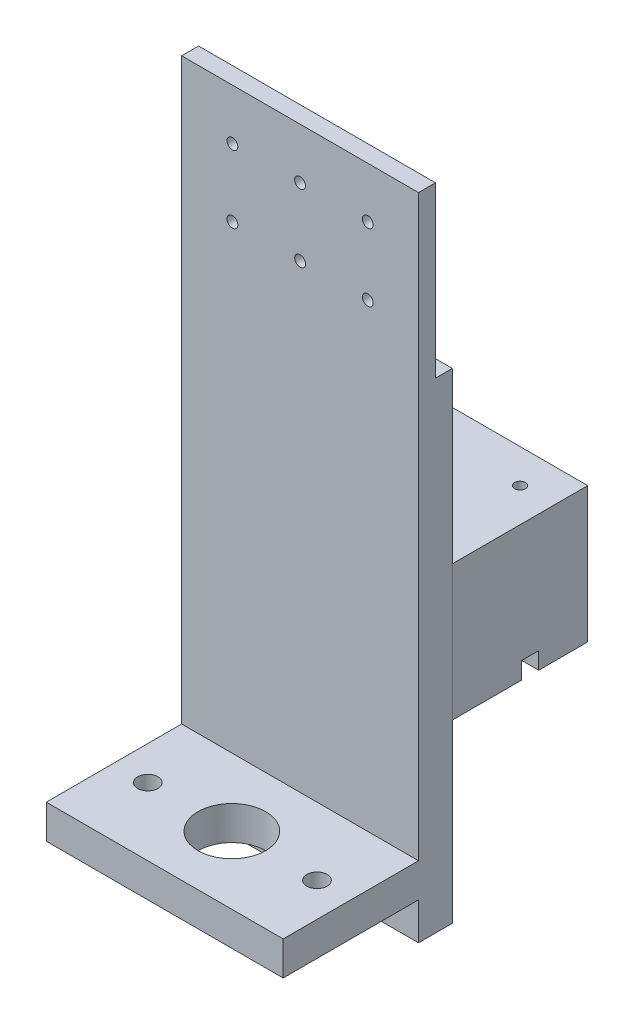
ISO-10303-21;
HEADER;
FILE_DESCRIPTION(('STEP AP214'),'2;1');
FILE_NAME('part.step','',(''),(''),'','','');
FILE_SCHEMA(('AUTOMOTIVE_DESIGN { 1 0 10303 214 1 1 1 1 }'));
ENDSEC;
DATA;
#1=APPLICATION_CONTEXT('core data for automotive mechanical design processes');
#2=APPLICATION_PROTOCOL_DEFINITION('international standard','automotive_design',2000,#1);
#3=PRODUCT_CONTEXT('',#1,'mechanical');
#4=PRODUCT('Part','Part','',(#3));
#5=PRODUCT_RELATED_PRODUCT_CATEGORY('part','',(#4));
#6=PRODUCT_DEFINITION_FORMATION('','',#4);
#7=PRODUCT_DEFINITION_CONTEXT('part definition',#1,'design');
#8=PRODUCT_DEFINITION('design','',#6,#7);
#9=PRODUCT_DEFINITION_SHAPE('','',#8);
#10=(LENGTH_UNIT() NAMED_UNIT(*) SI_UNIT(.MILLI.,.METRE.));
#11=(NAMED_UNIT(*) PLANE_ANGLE_UNIT() SI_UNIT($,.RADIAN.));
#12=(NAMED_UNIT(*) SI_UNIT($,.STERADIAN.) SOLID_ANGLE_UNIT());
#13=UNCERTAINTY_MEASURE_WITH_UNIT(LENGTH_MEASURE(1.E-05),#10,'distance_accuracy_value','');
#14=(GEOMETRIC_REPRESENTATION_CONTEXT(3) GLOBAL_UNCERTAINTY_ASSIGNED_CONTEXT((#13)) GLOBAL_UNIT_ASSIGNED_CONTEXT((#10,
#11,#12)) REPRESENTATION_CONTEXT('',''));
#15=CARTESIAN_POINT('',(0.,0.,0.));
#16=DIRECTION('',(0.,0.,1.));
#17=DIRECTION('',(1.,0.,0.));
#18=AXIS2_PLACEMENT_3D('',#15,#16,#17);
#19=CARTESIAN_POINT('',(37.8741031645975,90.,27.7151189199662));
#20=DIRECTION('',(0.,0.,1.));
#21=DIRECTION('',(1.,0.,0.));
#22=AXIS2_PLACEMENT_3D('',#19,#20,#21);
#23=PLANE('',#22);
#24=CARTESIAN_POINT('',(22.8641031645975,125.,27.7151189199662));
#25=DIRECTION('',(0.,0.,1.));
#26=DIRECTION('',(1.,0.,0.));
#27=AXIS2_PLACEMENT_3D('',#24,#25,#26);
#28=CIRCLE('',#27,1.60000000000001);
#29=CARTESIAN_POINT('',(24.4641031645975,125.,27.7151189199662));
#30=VERTEX_POINT('',#29);
#31=EDGE_CURVE('E250',#30,#30,#28,.F.);
#32=ORIENTED_EDGE('',*,*,#31,.F.);
#33=EDGE_LOOP('',(#32));
#34=FACE_BOUND('',#33,.T.);
#35=CARTESIAN_POINT('',(-17.1358968354025,125.,27.7151189199662));
#36=DIRECTION('',(0.,0.,1.));
#37=DIRECTION('',(1.,0.,0.));
#38=AXIS2_PLACEMENT_3D('',#35,#36,#37);
#39=CIRCLE('',#38,1.60000000000001);
#40=CARTESIAN_POINT('',(-15.5358968354025,125.,27.7151189199662));
#41=VERTEX_POINT('',#40);
#42=EDGE_CURVE('E244',#41,#41,#39,.F.);
#43=ORIENTED_EDGE('',*,*,#42,.F.);
#44=EDGE_LOOP('',(#43));
#45=FACE_BOUND('',#44,.T.);
#46=CARTESIAN_POINT('',(2.86410316459753,105.,27.7151189199662));
#47=DIRECTION('',(0.,0.,1.));
#48=DIRECTION('',(1.,0.,0.));
#49=AXIS2_PLACEMENT_3D('',#46,#47,#48);
#50=CIRCLE('',#49,1.60000000000001);
#51=CARTESIAN_POINT('',(4.46410316459754,105.,27.7151189199662));
#52=VERTEX_POINT('',#51);
#53=EDGE_CURVE('E225',#52,#52,#50,.F.);
#54=ORIENTED_EDGE('',*,*,#53,.F.);
#55=EDGE_LOOP('',(#54));
#56=FACE_BOUND('',#55,.T.);
#57=CARTESIAN_POINT('',(22.8641031645975,105.,27.7151189199662));
#58=DIRECTION('',(0.,0.,1.));
#59=DIRECTION('',(1.,0.,0.));
#60=AXIS2_PLACEMENT_3D('',#57,#58,#59);
#61=CIRCLE('',#60,1.60000000000001);
#62=CARTESIAN_POINT('',(24.4641031645975,105.,27.7151189199662));
#63=VERTEX_POINT('',#62);
#64=EDGE_CURVE('E228',#63,#63,#61,.F.);
#65=ORIENTED_EDGE('',*,*,#64,.F.);
#66=EDGE_LOOP('',(#65));
#67=FACE_BOUND('',#66,.T.);
#68=CARTESIAN_POINT('',(2.86410316459753,125.,27.7151189199662));
#69=DIRECTION('',(0.,0.,1.));
#70=DIRECTION('',(1.,0.,0.));
#71=AXIS2_PLACEMENT_3D('',#68,#69,#70);
#72=CIRCLE('',#71,1.60000000000001);
#73=CARTESIAN_POINT('',(4.46410316459754,125.,27.7151189199662));
#74=VERTEX_POINT('',#73);
#75=EDGE_CURVE('E247',#74,#74,#72,.F.);
#76=ORIENTED_EDGE('',*,*,#75,.F.);
#77=EDGE_LOOP('',(#76));
#78=FACE_BOUND('',#77,.T.);
#79=CARTESIAN_POINT('',(-17.1358968354025,105.,27.7151189199662));
#80=DIRECTION('',(0.,0.,1.));
#81=DIRECTION('',(1.,0.,0.));
#82=AXIS2_PLACEMENT_3D('',#79,#80,#81);
#83=CIRCLE('',#82,1.60000000000001);
#84=CARTESIAN_POINT('',(-15.5358968354025,105.,27.7151189199662));
#85=VERTEX_POINT('',#84);
#86=EDGE_CURVE('E231',#85,#85,#83,.F.);
#87=ORIENTED_EDGE('',*,*,#86,.F.);
#88=EDGE_LOOP('',(#87));
#89=FACE_BOUND('',#88,.T.);
#90=DIRECTION('',(-1.,0.,0.));
#91=VECTOR('',#90,1.);
#92=CARTESIAN_POINT('',(37.8741031645975,90.,27.7151189199662));
#93=LINE('',#92,#91);
#94=CARTESIAN_POINT('',(37.8641031645975,90.,27.7151189199662));
#95=VERTEX_POINT('',#94);
#96=CARTESIAN_POINT('',(-32.1358968354025,90.,27.7151189199662));
#97=VERTEX_POINT('',#96);
#98=EDGE_CURVE('E81',#95,#97,#93,.T.);
#99=ORIENTED_EDGE('',*,*,#98,.T.);
#100=DIRECTION('',(0.,-1.,0.));
#101=VECTOR('',#100,1.);
#102=CARTESIAN_POINT('',(-32.1358968354025,236.,27.7151189199662));
#103=LINE('',#102,#101);
#104=CARTESIAN_POINT('',(-32.1358968354025,140.,27.7151189199662));
#105=VERTEX_POINT('',#104);
#106=EDGE_CURVE('E89',#105,#97,#103,.T.);
#107=ORIENTED_EDGE('',*,*,#106,.F.);
#108=DIRECTION('',(-1.,0.,0.));
#109=VECTOR('',#108,1.);
#110=CARTESIAN_POINT('',(37.8741031645975,140.,27.7151189199662));
#111=LINE('',#110,#109);
#112=CARTESIAN_POINT('',(37.8641031645975,140.,27.7151189199662));
#113=VERTEX_POINT('',#112);
#114=EDGE_CURVE('E13',#113,#105,#111,.T.);
#115=ORIENTED_EDGE('',*,*,#114,.F.);
#116=DIRECTION('',(0.,1.,0.));
#117=VECTOR('',#116,1.);
#118=CARTESIAN_POINT('',(37.8641031645975,236.,27.7151189199662));
#119=LINE('',#118,#117);
#120=EDGE_CURVE('E255',#95,#113,#119,.T.);
#121=ORIENTED_EDGE('',*,*,#120,.F.);
#122=EDGE_LOOP('',(#99,#107,#115,#121));
#123=FACE_BOUND('',#122,.T.);
#124=ADVANCED_FACE('F72',(#34,#45,#56,#67,#78,#89,#123),#23,.F.);
#125=CARTESIAN_POINT('',(37.8741031645975,140.,27.7151189199662));
#126=DIRECTION('',(0.,-1.,0.));
#127=DIRECTION('',(0.,0.,-1.));
#128=AXIS2_PLACEMENT_3D('',#125,#126,#127);
#129=PLANE('',#128);
#130=ORIENTED_EDGE('',*,*,#114,.T.);
#131=DIRECTION('',(0.,0.,-1.));
#132=VECTOR('',#131,1.);
#133=CARTESIAN_POINT('',(-32.1358968354025,140.,22.7151189199662));
#134=LINE('',#133,#132);
#135=CARTESIAN_POINT('',(-32.1358968354025,140.,32.7151189199662));
#136=VERTEX_POINT('',#135);
#137=EDGE_CURVE('E229',#136,#105,#134,.T.);
#138=ORIENTED_EDGE('',*,*,#137,.F.);
#139=DIRECTION('',(-1.,0.,0.));
#140=VECTOR('',#139,1.);
#141=CARTESIAN_POINT('',(-32.1358968354025,140.,32.7151189199662));
#142=LINE('',#141,#140);
#143=CARTESIAN_POINT('',(37.8641031645975,140.,32.7151189199662));
#144=VERTEX_POINT('',#143);
#145=EDGE_CURVE('E239',#144,#136,#142,.T.);
#146=ORIENTED_EDGE('',*,*,#145,.F.);
#147=DIRECTION('',(0.,0.,1.));
#148=VECTOR('',#147,1.);
#149=CARTESIAN_POINT('',(37.8641031645975,140.,32.7151189199662));
#150=LINE('',#149,#148);
#151=EDGE_CURVE('E238',#113,#144,#150,.T.);
#152=ORIENTED_EDGE('',*,*,#151,.F.);
#153=EDGE_LOOP('',(#130,#138,#146,#152));
#154=FACE_BOUND('',#153,.T.);
#155=ADVANCED_FACE('F267',(#154),#129,.F.);
#156=CARTESIAN_POINT('',(37.8741031645975,90.,22.7151189199662));
#157=DIRECTION('',(0.,-1.,0.));
#158=DIRECTION('',(0.,0.,-1.));
#159=AXIS2_PLACEMENT_3D('',#156,#157,#158);
#160=PLANE('',#159);
#161=DIRECTION('',(1.,0.,0.));
#162=VECTOR('',#161,1.);
#163=CARTESIAN_POINT('',(37.8641031645975,90.,22.7151189199662));
#164=LINE('',#163,#162);
#165=CARTESIAN_POINT('',(-32.1358968354025,90.,22.7151189199662));
#166=VERTEX_POINT('',#165);
#167=CARTESIAN_POINT('',(37.8641031645975,90.,22.7151189199662));
#168=VERTEX_POINT('',#167);
#169=EDGE_CURVE('E235',#166,#168,#164,.T.);
#170=ORIENTED_EDGE('',*,*,#169,.F.);
#171=DIRECTION('',(0.,0.,-1.));
#172=VECTOR('',#171,1.);
#173=CARTESIAN_POINT('',(-32.1358968354025,90.,22.7151189199658));
#174=LINE('',#173,#172);
#175=EDGE_CURVE('E233',#97,#166,#174,.T.);
#176=ORIENTED_EDGE('',*,*,#175,.F.);
#177=ORIENTED_EDGE('',*,*,#98,.F.);
#178=DIRECTION('',(0.,0.,1.));
#179=VECTOR('',#178,1.);
#180=CARTESIAN_POINT('',(37.8641031645975,90.,32.7151189199658));
#181=LINE('',#180,#179);
#182=EDGE_CURVE('E76',#168,#95,#181,.T.);
#183=ORIENTED_EDGE('',*,*,#182,.F.);
#184=EDGE_LOOP('',(#170,#176,#177,#183));
#185=FACE_BOUND('',#184,.T.);
#186=ADVANCED_FACE('F74',(#185),#160,.F.);
#187=CARTESIAN_POINT('',(27.8641031645975,-37.,52.7151189199662));
#188=DIRECTION('',(0.,-1.,0.));
#189=DIRECTION('',(0.,0.,-1.));
#190=AXIS2_PLACEMENT_3D('',#187,#188,#189);
#191=PLANE('',#190);
#192=CARTESIAN_POINT('',(27.8641031645975,-37.,52.7151189199662));
#193=DIRECTION('',(0.,-1.,0.));
#194=DIRECTION('',(0.,0.,-1.));
#195=AXIS2_PLACEMENT_3D('',#192,#193,#194);
#196=CIRCLE('',#195,3.);
#197=CARTESIAN_POINT('',(27.8641031645975,-37.,49.7151189199662));
#198=VERTEX_POINT('',#197);
#199=EDGE_CURVE('E222',#198,#198,#196,.F.);
#200=ORIENTED_EDGE('',*,*,#199,.T.);
#201=EDGE_LOOP('',(#200));
#202=FACE_BOUND('',#201,.T.);
#203=ADVANCED_FACE('F377',(#202),#191,.F.);
#204=CARTESIAN_POINT('',(-22.1358968354025,-37.,52.7151189199662));
#205=DIRECTION('',(0.,-1.,0.));
#206=DIRECTION('',(0.,0.,-1.));
#207=AXIS2_PLACEMENT_3D('',#204,#205,#206);
#208=PLANE('',#207);
#209=CARTESIAN_POINT('',(-22.1358968354025,-37.,52.7151189199662));
#210=DIRECTION('',(0.,-1.,0.));
#211=DIRECTION('',(0.,0.,-1.));
#212=AXIS2_PLACEMENT_3D('',#209,#210,#211);
#213=CIRCLE('',#212,3.);
#214=CARTESIAN_POINT('',(-22.1358968354025,-37.,49.7151189199662));
#215=VERTEX_POINT('',#214);
#216=EDGE_CURVE('E211',#215,#215,#213,.F.);
#217=ORIENTED_EDGE('',*,*,#216,.T.);
#218=EDGE_LOOP('',(#217));
#219=FACE_BOUND('',#218,.T.);
#220=ADVANCED_FACE('F370',(#219),#208,.F.);
#221=CARTESIAN_POINT('',(27.8641031645975,261.,52.7151189199662));
#222=DIRECTION('',(0.,-1.,0.));
#223=DIRECTION('',(0.,0.,-1.));
#224=AXIS2_PLACEMENT_3D('',#221,#222,#223);
#225=CYLINDRICAL_SURFACE('',#224,3.);
#226=CARTESIAN_POINT('',(27.8641031645975,-31.,52.7151189199662));
#227=DIRECTION('',(0.,-1.,0.));
#228=DIRECTION('',(1.,0.,0.));
#229=AXIS2_PLACEMENT_3D('',#226,#227,#228);
#230=CIRCLE('',#229,3.);
#231=CARTESIAN_POINT('',(30.8641031645976,-31.,52.7151189199662));
#232=VERTEX_POINT('',#231);
#233=EDGE_CURVE('E212',#232,#232,#230,.T.);
#234=ORIENTED_EDGE('',*,*,#233,.F.);
#235=EDGE_LOOP('',(#234));
#236=FACE_BOUND('',#235,.T.);
#237=ORIENTED_EDGE('',*,*,#199,.F.);
#238=EDGE_LOOP('',(#237));
#239=FACE_BOUND('',#238,.T.);
#240=ADVANCED_FACE('F366',(#236,#239),#225,.F.);
#241=CARTESIAN_POINT('',(-22.1358968354025,261.,52.7151189199662));
#242=DIRECTION('',(0.,-1.,0.));
#243=DIRECTION('',(0.,0.,-1.));
#244=AXIS2_PLACEMENT_3D('',#241,#242,#243);
#245=CYLINDRICAL_SURFACE('',#244,3.);
#246=CARTESIAN_POINT('',(-22.1358968354025,-31.,52.7151189199662));
#247=DIRECTION('',(0.,-1.,0.));
#248=DIRECTION('',(1.,0.,0.));
#249=AXIS2_PLACEMENT_3D('',#246,#247,#248);
#250=CIRCLE('',#249,3.);
#251=CARTESIAN_POINT('',(-19.1358968354025,-31.,52.7151189199662));
#252=VERTEX_POINT('',#251);
#253=EDGE_CURVE('E215',#252,#252,#250,.T.);
#254=ORIENTED_EDGE('',*,*,#253,.F.);
#255=EDGE_LOOP('',(#254));
#256=FACE_BOUND('',#255,.T.);
#257=ORIENTED_EDGE('',*,*,#216,.F.);
#258=EDGE_LOOP('',(#257));
#259=FACE_BOUND('',#258,.T.);
#260=ADVANCED_FACE('F369',(#256,#259),#245,.F.);
#261=CARTESIAN_POINT('',(2.70445452144315,261.001,52.7151189199662));
#262=DIRECTION('',(0.,-1.,0.));
#263=DIRECTION('',(0.,0.,-1.));
#264=AXIS2_PLACEMENT_3D('',#261,#262,#263);
#265=CYLINDRICAL_SURFACE('',#264,10.);
#266=CARTESIAN_POINT('',(2.70445452144315,-41.,52.7151189199662));
#267=DIRECTION('',(0.,-1.,0.));
#268=DIRECTION('',(0.,0.,-1.));
#269=AXIS2_PLACEMENT_3D('',#266,#267,#268);
#270=CIRCLE('',#269,10.);
#271=CARTESIAN_POINT('',(2.70445452144315,-41.,42.7151189199662));
#272=VERTEX_POINT('',#271);
#273=EDGE_CURVE('E284',#272,#272,#270,.T.);
#274=ORIENTED_EDGE('',*,*,#273,.T.);
#275=EDGE_LOOP('',(#274));
#276=FACE_BOUND('',#275,.T.);
#277=CARTESIAN_POINT('',(2.70445452144315,-31.,52.7151189199662));
#278=DIRECTION('',(0.,-1.,0.));
#279=DIRECTION('',(1.,0.,0.));
#280=AXIS2_PLACEMENT_3D('',#277,#278,#279);
#281=CIRCLE('',#280,10.);
#282=CARTESIAN_POINT('',(12.7044545214432,-31.,52.7151189199662));
#283=VERTEX_POINT('',#282);
#284=EDGE_CURVE('E216',#283,#283,#281,.F.);
#285=ORIENTED_EDGE('',*,*,#284,.T.);
#286=EDGE_LOOP('',(#285));
#287=FACE_BOUND('',#286,.T.);
#288=ADVANCED_FACE('F336',(#276,#287),#265,.F.);
#289=CARTESIAN_POINT('',(37.8641031645975,236.,32.7151189199662));
#290=DIRECTION('',(-1.,0.,0.));
#291=DIRECTION('',(0.,0.,1.));
#292=AXIS2_PLACEMENT_3D('',#289,#290,#291);
#293=PLANE('',#292);
#294=DIRECTION('',(0.,-1.,0.));
#295=VECTOR('',#294,1.);
#296=CARTESIAN_POINT('',(37.8641031645975,236.,22.7151189199662));
#297=LINE('',#296,#295);
#298=CARTESIAN_POINT('',(37.8641031645975,-52.,22.7151189199662));
#299=VERTEX_POINT('',#298);
#300=EDGE_CURVE('E209',#168,#299,#297,.T.);
#301=ORIENTED_EDGE('',*,*,#300,.F.);
#302=ORIENTED_EDGE('',*,*,#182,.T.);
#303=ORIENTED_EDGE('',*,*,#120,.T.);
#304=ORIENTED_EDGE('',*,*,#151,.T.);
#305=DIRECTION('',(0.,-1.,0.));
#306=VECTOR('',#305,1.);
#307=CARTESIAN_POINT('',(37.8641031645975,236.,32.7151189199662));
#308=LINE('',#307,#306);
#309=CARTESIAN_POINT('',(37.8641031645975,-31.,32.7151189199662));
#310=VERTEX_POINT('',#309);
#311=EDGE_CURVE('E203',#144,#310,#308,.T.);
#312=ORIENTED_EDGE('',*,*,#311,.T.);
#313=DIRECTION('',(0.,0.,-1.));
#314=VECTOR('',#313,1.);
#315=CARTESIAN_POINT('',(37.8641031645975,-31.,72.7151189199662));
#316=LINE('',#315,#314);
#317=CARTESIAN_POINT('',(37.8641031645975,-31.,72.7151189199662));
#318=VERTEX_POINT('',#317);
#319=EDGE_CURVE('E179',#318,#310,#316,.T.);
#320=ORIENTED_EDGE('',*,*,#319,.F.);
#321=DIRECTION('',(0.,1.,0.));
#322=VECTOR('',#321,1.);
#323=CARTESIAN_POINT('',(37.8641031645975,-31.,72.7151189199662));
#324=LINE('',#323,#322);
#325=CARTESIAN_POINT('',(37.8641031645975,-41.,72.7151189199662));
#326=VERTEX_POINT('',#325);
#327=EDGE_CURVE('E159',#326,#318,#324,.T.);
#328=ORIENTED_EDGE('',*,*,#327,.F.);
#329=DIRECTION('',(0.,0.,-1.));
#330=VECTOR('',#329,1.);
#331=CARTESIAN_POINT('',(37.8641031645975,-41.,72.7151189199662));
#332=LINE('',#331,#330);
#333=CARTESIAN_POINT('',(37.8641031645975,-41.,32.7151189199662));
#334=VERTEX_POINT('',#333);
#335=EDGE_CURVE('E156',#326,#334,#332,.T.);
#336=ORIENTED_EDGE('',*,*,#335,.T.);
#337=CARTESIAN_POINT('',(37.8641031645975,-52.,32.7151189199662));
#338=VERTEX_POINT('',#337);
#339=EDGE_CURVE('E202',#334,#338,#308,.T.);
#340=ORIENTED_EDGE('',*,*,#339,.T.);
#341=DIRECTION('',(0.,0.,-1.));
#342=VECTOR('',#341,1.);
#343=CARTESIAN_POINT('',(37.8641031645975,-52.,32.7151189199662));
#344=LINE('',#343,#342);
#345=EDGE_CURVE('E186',#338,#299,#344,.T.);
#346=ORIENTED_EDGE('',*,*,#345,.T.);
#347=EDGE_LOOP('',(#301,#302,#303,#304,#312,#320,#328,#336,#340,#346));
#348=FACE_BOUND('',#347,.T.);
#349=ADVANCED_FACE('F260',(#348),#293,.F.);
#350=CARTESIAN_POINT('',(23.8641031645975,-48.,22.7151189199662));
#351=DIRECTION('',(0.,0.,1.));
#352=DIRECTION('',(1.,0.,0.));
#353=AXIS2_PLACEMENT_3D('',#350,#351,#352);
#354=CYLINDRICAL_SURFACE('',#353,2.5);
#355=CARTESIAN_POINT('',(23.8641031645975,-48.,22.7151189199662));
#356=DIRECTION('',(0.,0.,1.));
#357=DIRECTION('',(-1.,0.,0.));
#358=AXIS2_PLACEMENT_3D('',#355,#356,#357);
#359=CIRCLE('',#358,2.5);
#360=CARTESIAN_POINT('',(21.3641031645975,-48.,22.7151189199662));
#361=VERTEX_POINT('',#360);
#362=EDGE_CURVE('E174',#361,#361,#359,.T.);
#363=ORIENTED_EDGE('',*,*,#362,.F.);
#364=EDGE_LOOP('',(#363));
#365=FACE_BOUND('',#364,.T.);
#366=CARTESIAN_POINT('',(23.8641031645975,-48.,32.7151189199662));
#367=DIRECTION('',(0.,0.,1.));
#368=DIRECTION('',(-1.,0.,0.));
#369=AXIS2_PLACEMENT_3D('',#366,#367,#368);
#370=CIRCLE('',#369,2.5);
#371=CARTESIAN_POINT('',(21.3641031645975,-48.,32.7151189199662));
#372=VERTEX_POINT('',#371);
#373=EDGE_CURVE('E177',#372,#372,#370,.T.);
#374=ORIENTED_EDGE('',*,*,#373,.T.);
#375=EDGE_LOOP('',(#374));
#376=FACE_BOUND('',#375,.T.);
#377=ADVANCED_FACE('F335',(#365,#376),#354,.F.);
#378=CARTESIAN_POINT('',(-18.1358968354025,-48.,22.7151189199662));
#379=DIRECTION('',(0.,0.,1.));
#380=DIRECTION('',(1.,0.,0.));
#381=AXIS2_PLACEMENT_3D('',#378,#379,#380);
#382=CYLINDRICAL_SURFACE('',#381,2.5);
#383=CARTESIAN_POINT('',(-18.1358968354025,-48.,22.7151189199662));
#384=DIRECTION('',(0.,0.,1.));
#385=DIRECTION('',(1.,0.,0.));
#386=AXIS2_PLACEMENT_3D('',#383,#384,#385);
#387=CIRCLE('',#386,2.5);
#388=CARTESIAN_POINT('',(-15.6358968354025,-48.,22.7151189199662));
#389=VERTEX_POINT('',#388);
#390=EDGE_CURVE('E183',#389,#389,#387,.T.);
#391=ORIENTED_EDGE('',*,*,#390,.F.);
#392=EDGE_LOOP('',(#391));
#393=FACE_BOUND('',#392,.T.);
#394=CARTESIAN_POINT('',(-18.1358968354025,-48.,32.7151189199662));
#395=DIRECTION('',(0.,0.,1.));
#396=DIRECTION('',(1.,0.,0.));
#397=AXIS2_PLACEMENT_3D('',#394,#395,#396);
#398=CIRCLE('',#397,2.5);
#399=CARTESIAN_POINT('',(-15.6358968354025,-48.,32.7151189199662));
#400=VERTEX_POINT('',#399);
#401=EDGE_CURVE('E187',#400,#400,#398,.T.);
#402=ORIENTED_EDGE('',*,*,#401,.T.);
#403=EDGE_LOOP('',(#402));
#404=FACE_BOUND('',#403,.T.);
#405=ADVANCED_FACE('F353',(#393,#404),#382,.F.);
#406=CARTESIAN_POINT('',(-32.1358968354025,236.,32.7151189199662));
#407=DIRECTION('',(0.,0.,-1.));
#408=DIRECTION('',(-1.,0.,0.));
#409=AXIS2_PLACEMENT_3D('',#406,#407,#408);
#410=PLANE('',#409);
#411=CARTESIAN_POINT('',(2.86410316459753,105.,32.7151189199662));
#412=DIRECTION('',(0.,0.,-1.));
#413=DIRECTION('',(-1.,0.,0.));
#414=AXIS2_PLACEMENT_3D('',#411,#412,#413);
#415=CIRCLE('',#414,1.60000000000001);
#416=CARTESIAN_POINT('',(1.26410316459752,105.,32.7151189199662));
#417=VERTEX_POINT('',#416);
#418=EDGE_CURVE('E290',#417,#417,#415,.T.);
#419=ORIENTED_EDGE('',*,*,#418,.T.);
#420=EDGE_LOOP('',(#419));
#421=FACE_BOUND('',#420,.T.);
#422=CARTESIAN_POINT('',(22.8641031645975,105.,32.7151189199662));
#423=DIRECTION('',(0.,0.,-1.));
#424=DIRECTION('',(-1.,0.,0.));
#425=AXIS2_PLACEMENT_3D('',#422,#423,#424);
#426=CIRCLE('',#425,1.60000000000001);
#427=CARTESIAN_POINT('',(21.2641031645975,105.,32.7151189199662));
#428=VERTEX_POINT('',#427);
#429=EDGE_CURVE('E298',#428,#428,#426,.T.);
#430=ORIENTED_EDGE('',*,*,#429,.T.);
#431=EDGE_LOOP('',(#430));
#432=FACE_BOUND('',#431,.T.);
#433=CARTESIAN_POINT('',(-17.1358968354025,125.,32.7151189199662));
#434=DIRECTION('',(0.,0.,-1.));
#435=DIRECTION('',(1.,0.,0.));
#436=AXIS2_PLACEMENT_3D('',#433,#434,#435);
#437=CIRCLE('',#436,1.60000000000001);
#438=CARTESIAN_POINT('',(-15.5358968354025,125.,32.7151189199662));
#439=VERTEX_POINT('',#438);
#440=EDGE_CURVE('E294',#439,#439,#437,.T.);
#441=ORIENTED_EDGE('',*,*,#440,.T.);
#442=EDGE_LOOP('',(#441));
#443=FACE_BOUND('',#442,.T.);
#444=CARTESIAN_POINT('',(2.86410316459753,125.,32.7151189199662));
#445=DIRECTION('',(0.,0.,-1.));
#446=DIRECTION('',(1.,0.,0.));
#447=AXIS2_PLACEMENT_3D('',#444,#445,#446);
#448=CIRCLE('',#447,1.60000000000001);
#449=CARTESIAN_POINT('',(4.46410316459754,125.,32.7151189199662));
#450=VERTEX_POINT('',#449);
#451=EDGE_CURVE('E291',#450,#450,#448,.T.);
#452=ORIENTED_EDGE('',*,*,#451,.T.);
#453=EDGE_LOOP('',(#452));
#454=FACE_BOUND('',#453,.T.);
#455=CARTESIAN_POINT('',(22.8641031645975,125.,32.7151189199662));
#456=DIRECTION('',(0.,0.,-1.));
#457=DIRECTION('',(1.,0.,0.));
#458=AXIS2_PLACEMENT_3D('',#455,#456,#457);
#459=CIRCLE('',#458,1.60000000000001);
#460=CARTESIAN_POINT('',(24.4641031645975,125.,32.7151189199662));
#461=VERTEX_POINT('',#460);
#462=EDGE_CURVE('E295',#461,#461,#459,.T.);
#463=ORIENTED_EDGE('',*,*,#462,.T.);
#464=EDGE_LOOP('',(#463));
#465=FACE_BOUND('',#464,.T.);
#466=CARTESIAN_POINT('',(-17.1358968354025,105.,32.7151189199662));
#467=DIRECTION('',(0.,0.,-1.));
#468=DIRECTION('',(-1.,0.,0.));
#469=AXIS2_PLACEMENT_3D('',#466,#467,#468);
#470=CIRCLE('',#469,1.60000000000001);
#471=CARTESIAN_POINT('',(-18.7358968354025,105.,32.7151189199662));
#472=VERTEX_POINT('',#471);
#473=EDGE_CURVE('E287',#472,#472,#470,.T.);
#474=ORIENTED_EDGE('',*,*,#473,.T.);
#475=EDGE_LOOP('',(#474));
#476=FACE_BOUND('',#475,.T.);
#477=ORIENTED_EDGE('',*,*,#311,.F.);
#478=ORIENTED_EDGE('',*,*,#145,.T.);
#479=DIRECTION('',(0.,-1.,0.));
#480=VECTOR('',#479,1.);
#481=CARTESIAN_POINT('',(-32.1358968354025,236.,32.7151189199662));
#482=LINE('',#481,#480);
#483=CARTESIAN_POINT('',(-32.1358968354025,-31.,32.7151189199662));
#484=VERTEX_POINT('',#483);
#485=EDGE_CURVE('E205',#136,#484,#482,.T.);
#486=ORIENTED_EDGE('',*,*,#485,.T.);
#487=DIRECTION('',(-1.,0.,0.));
#488=VECTOR('',#487,1.);
#489=CARTESIAN_POINT('',(-32.1358968354025,-31.,32.7151189199662));
#490=LINE('',#489,#488);
#491=EDGE_CURVE('E168',#310,#484,#490,.T.);
#492=ORIENTED_EDGE('',*,*,#491,.F.);
#493=EDGE_LOOP('',(#477,#478,#486,#492));
#494=FACE_BOUND('',#493,.T.);
#495=ADVANCED_FACE('F270',(#421,#432,#443,#454,#465,#476,#494),#410,.F.);
#496=CARTESIAN_POINT('',(2.86410316459753,105.,32.7151189199662));
#497=DIRECTION('',(0.,0.,-1.));
#498=DIRECTION('',(-1.,0.,0.));
#499=AXIS2_PLACEMENT_3D('',#496,#497,#498);
#500=CYLINDRICAL_SURFACE('',#499,1.60000000000001);
#501=ORIENTED_EDGE('',*,*,#53,.T.);
#502=EDGE_LOOP('',(#501));
#503=FACE_BOUND('',#502,.T.);
#504=ORIENTED_EDGE('',*,*,#418,.F.);
#505=EDGE_LOOP('',(#504));
#506=FACE_BOUND('',#505,.T.);
#507=ADVANCED_FACE('F390',(#503,#506),#500,.F.);
#508=CARTESIAN_POINT('',(22.8641031645975,105.,32.7151189199662));
#509=DIRECTION('',(0.,0.,-1.));
#510=DIRECTION('',(-1.,0.,0.));
#511=AXIS2_PLACEMENT_3D('',#508,#509,#510);
#512=CYLINDRICAL_SURFACE('',#511,1.60000000000001);
#513=ORIENTED_EDGE('',*,*,#64,.T.);
#514=EDGE_LOOP('',(#513));
#515=FACE_BOUND('',#514,.T.);
#516=ORIENTED_EDGE('',*,*,#429,.F.);
#517=EDGE_LOOP('',(#516));
#518=FACE_BOUND('',#517,.T.);
#519=ADVANCED_FACE('F387',(#515,#518),#512,.F.);
#520=CARTESIAN_POINT('',(-17.1358968354025,125.,32.7151189199662));
#521=DIRECTION('',(0.,0.,-1.));
#522=DIRECTION('',(-1.,0.,0.));
#523=AXIS2_PLACEMENT_3D('',#520,#521,#522);
#524=CYLINDRICAL_SURFACE('',#523,1.60000000000001);
#525=ORIENTED_EDGE('',*,*,#42,.T.);
#526=EDGE_LOOP('',(#525));
#527=FACE_BOUND('',#526,.T.);
#528=ORIENTED_EDGE('',*,*,#440,.F.);
#529=EDGE_LOOP('',(#528));
#530=FACE_BOUND('',#529,.T.);
#531=ADVANCED_FACE('F320',(#527,#530),#524,.F.);
#532=CARTESIAN_POINT('',(2.86410316459753,125.,32.7151189199662));
#533=DIRECTION('',(0.,0.,-1.));
#534=DIRECTION('',(-1.,0.,0.));
#535=AXIS2_PLACEMENT_3D('',#532,#533,#534);
#536=CYLINDRICAL_SURFACE('',#535,1.60000000000001);
#537=ORIENTED_EDGE('',*,*,#75,.T.);
#538=EDGE_LOOP('',(#537));
#539=FACE_BOUND('',#538,.T.);
#540=ORIENTED_EDGE('',*,*,#451,.F.);
#541=EDGE_LOOP('',(#540));
#542=FACE_BOUND('',#541,.T.);
#543=ADVANCED_FACE('F311',(#539,#542),#536,.F.);
#544=CARTESIAN_POINT('',(22.8641031645975,125.,32.7151189199662));
#545=DIRECTION('',(0.,0.,-1.));
#546=DIRECTION('',(-1.,0.,0.));
#547=AXIS2_PLACEMENT_3D('',#544,#545,#546);
#548=CYLINDRICAL_SURFACE('',#547,1.60000000000001);
#549=ORIENTED_EDGE('',*,*,#31,.T.);
#550=EDGE_LOOP('',(#549));
#551=FACE_BOUND('',#550,.T.);
#552=ORIENTED_EDGE('',*,*,#462,.F.);
#553=EDGE_LOOP('',(#552));
#554=FACE_BOUND('',#553,.T.);
#555=ADVANCED_FACE('F308',(#551,#554),#548,.F.);
#556=CARTESIAN_POINT('',(-17.1358968354025,105.,32.7151189199662));
#557=DIRECTION('',(0.,0.,-1.));
#558=DIRECTION('',(-1.,0.,0.));
#559=AXIS2_PLACEMENT_3D('',#556,#557,#558);
#560=CYLINDRICAL_SURFACE('',#559,1.60000000000001);
#561=ORIENTED_EDGE('',*,*,#86,.T.);
#562=EDGE_LOOP('',(#561));
#563=FACE_BOUND('',#562,.T.);
#564=ORIENTED_EDGE('',*,*,#473,.F.);
#565=EDGE_LOOP('',(#564));
#566=FACE_BOUND('',#565,.T.);
#567=ADVANCED_FACE('F310',(#563,#566),#560,.F.);
#568=CARTESIAN_POINT('',(-32.1358968354025,-31.,72.7151189199662));
#569=DIRECTION('',(0.,-1.,0.));
#570=DIRECTION('',(1.,0.,0.));
#571=AXIS2_PLACEMENT_3D('',#568,#569,#570);
#572=PLANE('',#571);
#573=ORIENTED_EDGE('',*,*,#284,.F.);
#574=EDGE_LOOP('',(#573));
#575=FACE_BOUND('',#574,.T.);
#576=ORIENTED_EDGE('',*,*,#253,.T.);
#577=EDGE_LOOP('',(#576));
#578=FACE_BOUND('',#577,.T.);
#579=ORIENTED_EDGE('',*,*,#233,.T.);
#580=EDGE_LOOP('',(#579));
#581=FACE_BOUND('',#580,.T.);
#582=ORIENTED_EDGE('',*,*,#491,.T.);
#583=DIRECTION('',(0.,0.,-1.));
#584=VECTOR('',#583,1.);
#585=CARTESIAN_POINT('',(-32.1358968354025,-31.,72.7151189199662));
#586=LINE('',#585,#584);
#587=CARTESIAN_POINT('',(-32.1358968354025,-31.,72.7151189199662));
#588=VERTEX_POINT('',#587);
#589=EDGE_CURVE('E276',#588,#484,#586,.T.);
#590=ORIENTED_EDGE('',*,*,#589,.F.);
#591=DIRECTION('',(-1.,0.,0.));
#592=VECTOR('',#591,1.);
#593=CARTESIAN_POINT('',(-32.1358968354025,-31.,72.7151189199662));
#594=LINE('',#593,#592);
#595=EDGE_CURVE('E165',#318,#588,#594,.T.);
#596=ORIENTED_EDGE('',*,*,#595,.F.);
#597=ORIENTED_EDGE('',*,*,#319,.T.);
#598=EDGE_LOOP('',(#582,#590,#596,#597));
#599=FACE_BOUND('',#598,.T.);
#600=ADVANCED_FACE('F275',(#575,#578,#581,#599),#572,.F.);
#601=CARTESIAN_POINT('',(0.,0.,72.7151189199662));
#602=DIRECTION('',(0.,0.,-1.));
#603=DIRECTION('',(-1.,0.,0.));
#604=AXIS2_PLACEMENT_3D('',#601,#602,#603);
#605=PLANE('',#604);
#606=DIRECTION('',(0.,-1.,0.));
#607=VECTOR('',#606,1.);
#608=CARTESIAN_POINT('',(-32.1358968354025,-41.,72.7151189199662));
#609=LINE('',#608,#607);
#610=CARTESIAN_POINT('',(-32.1358968354025,-41.,72.7151189199662));
#611=VERTEX_POINT('',#610);
#612=EDGE_CURVE('E160',#588,#611,#609,.T.);
#613=ORIENTED_EDGE('',*,*,#612,.T.);
#614=DIRECTION('',(1.,0.,0.));
#615=VECTOR('',#614,1.);
#616=CARTESIAN_POINT('',(-32.1358968354025,-41.,72.7151189199662));
#617=LINE('',#616,#615);
#618=EDGE_CURVE('E149',#611,#326,#617,.T.);
#619=ORIENTED_EDGE('',*,*,#618,.T.);
#620=ORIENTED_EDGE('',*,*,#327,.T.);
#621=ORIENTED_EDGE('',*,*,#595,.T.);
#622=EDGE_LOOP('',(#613,#619,#620,#621));
#623=FACE_BOUND('',#622,.T.);
#624=ADVANCED_FACE('F163',(#623),#605,.F.);
#625=CARTESIAN_POINT('',(-32.1358968354025,-41.,72.7151189199662));
#626=DIRECTION('',(0.,1.,0.));
#627=DIRECTION('',(0.,0.,1.));
#628=AXIS2_PLACEMENT_3D('',#625,#626,#627);
#629=PLANE('',#628);
#630=ORIENTED_EDGE('',*,*,#273,.F.);
#631=EDGE_LOOP('',(#630));
#632=FACE_BOUND('',#631,.T.);
#633=DIRECTION('',(1.,0.,0.));
#634=VECTOR('',#633,1.);
#635=CARTESIAN_POINT('',(-32.1358968354025,-41.,32.7151189199662));
#636=LINE('',#635,#634);
#637=CARTESIAN_POINT('',(-32.1358968354025,-41.,32.7151189199662));
#638=VERTEX_POINT('',#637);
#639=EDGE_CURVE('E219',#638,#334,#636,.T.);
#640=ORIENTED_EDGE('',*,*,#639,.T.);
#641=ORIENTED_EDGE('',*,*,#335,.F.);
#642=ORIENTED_EDGE('',*,*,#618,.F.);
#643=DIRECTION('',(0.,0.,-1.));
#644=VECTOR('',#643,1.);
#645=CARTESIAN_POINT('',(-32.1358968354025,-41.,72.7151189199662));
#646=LINE('',#645,#644);
#647=EDGE_CURVE('E154',#611,#638,#646,.T.);
#648=ORIENTED_EDGE('',*,*,#647,.T.);
#649=EDGE_LOOP('',(#640,#641,#642,#648));
#650=FACE_BOUND('',#649,.T.);
#651=ADVANCED_FACE('F152',(#632,#650),#629,.F.);
#652=ORIENTED_EDGE('',*,*,#373,.F.);
#653=EDGE_LOOP('',(#652));
#654=FACE_BOUND('',#653,.T.);
#655=ORIENTED_EDGE('',*,*,#401,.F.);
#656=EDGE_LOOP('',(#655));
#657=FACE_BOUND('',#656,.T.);
#658=ORIENTED_EDGE('',*,*,#639,.F.);
#659=CARTESIAN_POINT('',(-32.1358968354025,-52.,32.7151189199662));
#660=VERTEX_POINT('',#659);
#661=EDGE_CURVE('E173',#638,#660,#482,.T.);
#662=ORIENTED_EDGE('',*,*,#661,.T.);
#663=DIRECTION('',(1.,0.,0.));
#664=VECTOR('',#663,1.);
#665=CARTESIAN_POINT('',(-32.1358968354025,-52.,32.7151189199662));
#666=LINE('',#665,#664);
#667=EDGE_CURVE('E199',#660,#338,#666,.T.);
#668=ORIENTED_EDGE('',*,*,#667,.T.);
#669=ORIENTED_EDGE('',*,*,#339,.F.);
#670=EDGE_LOOP('',(#658,#662,#668,#669));
#671=FACE_BOUND('',#670,.T.);
#672=ADVANCED_FACE('F344',(#654,#657,#671),#410,.F.);
#673=CARTESIAN_POINT('',(0.,-52.,0.));
#674=DIRECTION('',(0.,1.,0.));
#675=DIRECTION('',(0.,0.,1.));
#676=AXIS2_PLACEMENT_3D('',#673,#674,#675);
#677=PLANE('',#676);
#678=ORIENTED_EDGE('',*,*,#345,.F.);
#679=ORIENTED_EDGE('',*,*,#667,.F.);
#680=DIRECTION('',(0.,0.,1.));
#681=VECTOR('',#680,1.);
#682=CARTESIAN_POINT('',(-32.1358968354025,-52.,22.7151189199662));
#683=LINE('',#682,#681);
#684=CARTESIAN_POINT('',(-32.1358968354025,-52.,22.7151189199662));
#685=VERTEX_POINT('',#684);
#686=EDGE_CURVE('E197',#685,#660,#683,.T.);
#687=ORIENTED_EDGE('',*,*,#686,.F.);
#688=DIRECTION('',(-1.,0.,0.));
#689=VECTOR('',#688,1.);
#690=CARTESIAN_POINT('',(37.8641031645975,-52.,22.7151189199662));
#691=LINE('',#690,#689);
#692=EDGE_CURVE('E194',#299,#685,#691,.T.);
#693=ORIENTED_EDGE('',*,*,#692,.F.);
#694=EDGE_LOOP('',(#678,#679,#687,#693));
#695=FACE_BOUND('',#694,.T.);
#696=ADVANCED_FACE('F340',(#695),#677,.F.);
#697=CARTESIAN_POINT('',(37.8641031645975,236.,22.7151189199662));
#698=DIRECTION('',(0.,0.,1.));
#699=DIRECTION('',(1.,0.,0.));
#700=AXIS2_PLACEMENT_3D('',#697,#698,#699);
#701=PLANE('',#700);
#702=ORIENTED_EDGE('',*,*,#390,.T.);
#703=EDGE_LOOP('',(#702));
#704=FACE_BOUND('',#703,.T.);
#705=ORIENTED_EDGE('',*,*,#362,.T.);
#706=EDGE_LOOP('',(#705));
#707=FACE_BOUND('',#706,.T.);
#708=DIRECTION('',(0.,-1.,0.));
#709=VECTOR('',#708,1.);
#710=CARTESIAN_POINT('',(-32.1358968354025,236.,22.7151189199662));
#711=LINE('',#710,#709);
#712=EDGE_CURVE('E207',#166,#685,#711,.T.);
#713=ORIENTED_EDGE('',*,*,#712,.F.);
#714=ORIENTED_EDGE('',*,*,#169,.T.);
#715=ORIENTED_EDGE('',*,*,#300,.T.);
#716=ORIENTED_EDGE('',*,*,#692,.T.);
#717=EDGE_LOOP('',(#713,#714,#715,#716));
#718=FACE_BOUND('',#717,.T.);
#719=ADVANCED_FACE('F337',(#704,#707,#718),#701,.F.);
#720=CARTESIAN_POINT('',(-32.1358968354025,236.,22.7151189199662));
#721=DIRECTION('',(1.,0.,0.));
#722=DIRECTION('',(0.,0.,-1.));
#723=AXIS2_PLACEMENT_3D('',#720,#721,#722);
#724=PLANE('',#723);
#725=ORIENTED_EDGE('',*,*,#106,.T.);
#726=ORIENTED_EDGE('',*,*,#175,.T.);
#727=ORIENTED_EDGE('',*,*,#712,.T.);
#728=ORIENTED_EDGE('',*,*,#686,.T.);
#729=ORIENTED_EDGE('',*,*,#661,.F.);
#730=ORIENTED_EDGE('',*,*,#647,.F.);
#731=ORIENTED_EDGE('',*,*,#612,.F.);
#732=ORIENTED_EDGE('',*,*,#589,.T.);
#733=ORIENTED_EDGE('',*,*,#485,.F.);
#734=ORIENTED_EDGE('',*,*,#137,.T.);
#735=EDGE_LOOP('',(#725,#726,#727,#728,#729,#730,#731,#732,#733,#734));
#736=FACE_BOUND('',#735,.T.);
#737=ADVANCED_FACE('F171',(#736),#724,.F.);
#738=CLOSED_SHELL('',(#124,#155,#186,#203,#220,#240,#260,#288,#349,#377,#405,#495,#507,#519,
#531,#543,#555,#567,#600,#624,#651,#672,#696,#719,#737));
#739=MANIFOLD_SOLID_BREP('B2',#738);
#740=CARTESIAN_POINT('',(0.,0.,0.));
#741=DIRECTION('',(0.,1.,0.));
#742=DIRECTION('',(0.,0.,1.));
#743=AXIS2_PLACEMENT_3D('',#740,#741,#742);
#744=PLANE('',#743);
#745=CARTESIAN_POINT('',(-22.1358968354025,0.,17.7151189199662));
#746=DIRECTION('',(0.,-1.,0.));
#747=DIRECTION('',(0.,0.,-1.));
#748=AXIS2_PLACEMENT_3D('',#745,#746,#747);
#749=CIRCLE('',#748,1.6);
#750=CARTESIAN_POINT('',(-22.1358968354025,0.,16.1151189199662));
#751=VERTEX_POINT('',#750);
#752=EDGE_CURVE('E773',#751,#751,#749,.T.);
#753=ORIENTED_EDGE('',*,*,#752,.F.);
#754=EDGE_LOOP('',(#753));
#755=FACE_BOUND('',#754,.T.);
#756=CARTESIAN_POINT('',(27.8641031645975,0.,17.7151189199662));
#757=DIRECTION('',(0.,-1.,0.));
#758=DIRECTION('',(0.,0.,1.));
#759=AXIS2_PLACEMENT_3D('',#756,#757,#758);
#760=CIRCLE('',#759,1.6);
#761=CARTESIAN_POINT('',(27.8641031645975,0.,19.3151189199662));
#762=VERTEX_POINT('',#761);
#763=EDGE_CURVE('E777',#762,#762,#760,.T.);
#764=ORIENTED_EDGE('',*,*,#763,.F.);
#765=EDGE_LOOP('',(#764));
#766=FACE_BOUND('',#765,.T.);
#767=DIRECTION('',(0.,0.,1.));
#768=VECTOR('',#767,1.);
#769=CARTESIAN_POINT('',(-32.1358968354025,0.,-17.2848810800338));
#770=LINE('',#769,#768);
#771=CARTESIAN_POINT('',(-32.1358968354025,0.,2.21511891996617));
#772=VERTEX_POINT('',#771);
#773=CARTESIAN_POINT('',(-32.1358968354025,0.,22.7151189199662));
#774=VERTEX_POINT('',#773);
#775=EDGE_CURVE('E785',#772,#774,#770,.T.);
#776=ORIENTED_EDGE('',*,*,#775,.F.);
#777=DIRECTION('',(-1.,0.,0.));
#778=VECTOR('',#777,1.);
#779=CARTESIAN_POINT('',(-32.1358968354025,0.,2.21511891996617));
#780=LINE('',#779,#778);
#781=CARTESIAN_POINT('',(37.8641031645975,0.,2.21511891996617));
#782=VERTEX_POINT('',#781);
#783=EDGE_CURVE('E751',#782,#772,#780,.T.);
#784=ORIENTED_EDGE('',*,*,#783,.F.);
#785=DIRECTION('',(0.,0.,-1.));
#786=VECTOR('',#785,1.);
#787=CARTESIAN_POINT('',(37.8641031645975,0.,-17.2848810800338));
#788=LINE('',#787,#786);
#789=CARTESIAN_POINT('',(37.8641031645975,0.,22.7151189199662));
#790=VERTEX_POINT('',#789);
#791=EDGE_CURVE('E799',#790,#782,#788,.T.);
#792=ORIENTED_EDGE('',*,*,#791,.F.);
#793=DIRECTION('',(1.,0.,0.));
#794=VECTOR('',#793,1.);
#795=CARTESIAN_POINT('',(-32.1358968354025,0.,22.7151189199662));
#796=LINE('',#795,#794);
#797=EDGE_CURVE('E796',#774,#790,#796,.T.);
#798=ORIENTED_EDGE('',*,*,#797,.F.);
#799=EDGE_LOOP('',(#776,#784,#792,#798));
#800=FACE_BOUND('',#799,.T.);
#801=ADVANCED_FACE('F662',(#755,#766,#800),#744,.F.);
#802=CARTESIAN_POINT('',(-32.1358968354025,40.,-17.2848810800338));
#803=DIRECTION('',(1.,0.,0.));
#804=DIRECTION('',(0.,0.,-1.));
#805=AXIS2_PLACEMENT_3D('',#802,#803,#804);
#806=PLANE('',#805);
#807=DIRECTION('',(0.,0.,-1.));
#808=VECTOR('',#807,1.);
#809=CARTESIAN_POINT('',(-32.1358968354025,5.,-2.78488108003383));
#810=LINE('',#809,#808);
#811=CARTESIAN_POINT('',(-32.1358968354025,5.,2.21511891996617));
#812=VERTEX_POINT('',#811);
#813=CARTESIAN_POINT('',(-32.1358968354025,5.,-2.78488108003383));
#814=VERTEX_POINT('',#813);
#815=EDGE_CURVE('E742',#812,#814,#810,.T.);
#816=ORIENTED_EDGE('',*,*,#815,.F.);
#817=DIRECTION('',(0.,-1.,0.));
#818=VECTOR('',#817,1.);
#819=CARTESIAN_POINT('',(-32.1358968354025,5.,2.21511891996617));
#820=LINE('',#819,#818);
#821=EDGE_CURVE('E769',#812,#772,#820,.T.);
#822=ORIENTED_EDGE('',*,*,#821,.T.);
#823=ORIENTED_EDGE('',*,*,#775,.T.);
#824=DIRECTION('',(0.,-1.,0.));
#825=VECTOR('',#824,1.);
#826=CARTESIAN_POINT('',(-32.1358968354025,40.,22.7151189199662));
#827=LINE('',#826,#825);
#828=CARTESIAN_POINT('',(-32.1358968354025,40.,22.7151189199662));
#829=VERTEX_POINT('',#828);
#830=EDGE_CURVE('E70',#829,#774,#827,.T.);
#831=ORIENTED_EDGE('',*,*,#830,.F.);
#832=DIRECTION('',(0.,0.,1.));
#833=VECTOR('',#832,1.);
#834=CARTESIAN_POINT('',(-32.1358968354025,40.,-17.2848810800338));
#835=LINE('',#834,#833);
#836=CARTESIAN_POINT('',(-32.1358968354025,40.,-17.2848810800338));
#837=VERTEX_POINT('',#836);
#838=EDGE_CURVE('E788',#837,#829,#835,.T.);
#839=ORIENTED_EDGE('',*,*,#838,.F.);
#840=DIRECTION('',(0.,-1.,0.));
#841=VECTOR('',#840,1.);
#842=CARTESIAN_POINT('',(-32.1358968354025,40.,-17.2848810800338));
#843=LINE('',#842,#841);
#844=CARTESIAN_POINT('',(-32.1358968354025,0.,-17.2848810800338));
#845=VERTEX_POINT('',#844);
#846=EDGE_CURVE('E794',#837,#845,#843,.T.);
#847=ORIENTED_EDGE('',*,*,#846,.T.);
#848=CARTESIAN_POINT('',(-32.1358968354025,0.,-2.78488108003382));
#849=VERTEX_POINT('',#848);
#850=EDGE_CURVE('E755',#845,#849,#770,.T.);
#851=ORIENTED_EDGE('',*,*,#850,.T.);
#852=DIRECTION('',(0.,-1.,0.));
#853=VECTOR('',#852,1.);
#854=CARTESIAN_POINT('',(-32.1358968354025,5.,-2.78488108003383));
#855=LINE('',#854,#853);
#856=EDGE_CURVE('E677',#814,#849,#855,.T.);
#857=ORIENTED_EDGE('',*,*,#856,.F.);
#858=EDGE_LOOP('',(#816,#822,#823,#831,#839,#847,#851,#857));
#859=FACE_BOUND('',#858,.T.);
#860=ADVANCED_FACE('F664',(#859),#806,.F.);
#861=CARTESIAN_POINT('',(-32.1358968354025,40.,22.7151189199662));
#862=DIRECTION('',(0.,0.,-1.));
#863=DIRECTION('',(-1.,0.,0.));
#864=AXIS2_PLACEMENT_3D('',#861,#862,#863);
#865=PLANE('',#864);
#866=ORIENTED_EDGE('',*,*,#797,.T.);
#867=DIRECTION('',(0.,-1.,0.));
#868=VECTOR('',#867,1.);
#869=CARTESIAN_POINT('',(37.8641031645975,40.,22.7151189199662));
#870=LINE('',#869,#868);
#871=CARTESIAN_POINT('',(37.8641031645975,40.,22.7151189199662));
#872=VERTEX_POINT('',#871);
#873=EDGE_CURVE('E670',#872,#790,#870,.T.);
#874=ORIENTED_EDGE('',*,*,#873,.F.);
#875=DIRECTION('',(1.,0.,0.));
#876=VECTOR('',#875,1.);
#877=CARTESIAN_POINT('',(-32.1358968354025,40.,22.7151189199662));
#878=LINE('',#877,#876);
#879=EDGE_CURVE('E714',#829,#872,#878,.T.);
#880=ORIENTED_EDGE('',*,*,#879,.F.);
#881=ORIENTED_EDGE('',*,*,#830,.T.);
#882=EDGE_LOOP('',(#866,#874,#880,#881));
#883=FACE_BOUND('',#882,.T.);
#884=ADVANCED_FACE('F849',(#883),#865,.F.);
#885=CARTESIAN_POINT('',(37.8641031645975,40.,-17.2848810800338));
#886=DIRECTION('',(-1.,0.,0.));
#887=DIRECTION('',(0.,0.,1.));
#888=AXIS2_PLACEMENT_3D('',#885,#886,#887);
#889=PLANE('',#888);
#890=ORIENTED_EDGE('',*,*,#791,.T.);
#891=DIRECTION('',(0.,-1.,0.));
#892=VECTOR('',#891,1.);
#893=CARTESIAN_POINT('',(37.8641031645975,5.,2.21511891996617));
#894=LINE('',#893,#892);
#895=CARTESIAN_POINT('',(37.8641031645975,5.,2.21511891996617));
#896=VERTEX_POINT('',#895);
#897=EDGE_CURVE('E757',#896,#782,#894,.T.);
#898=ORIENTED_EDGE('',*,*,#897,.F.);
#899=DIRECTION('',(0.,0.,1.));
#900=VECTOR('',#899,1.);
#901=CARTESIAN_POINT('',(37.8641031645975,5.,2.21511891996617));
#902=LINE('',#901,#900);
#903=CARTESIAN_POINT('',(37.8641031645975,5.,-2.78488108003382));
#904=VERTEX_POINT('',#903);
#905=EDGE_CURVE('E741',#904,#896,#902,.T.);
#906=ORIENTED_EDGE('',*,*,#905,.F.);
#907=DIRECTION('',(0.,-1.,0.));
#908=VECTOR('',#907,1.);
#909=CARTESIAN_POINT('',(37.8641031645975,5.,-2.78488108003382));
#910=LINE('',#909,#908);
#911=CARTESIAN_POINT('',(37.8641031645975,0.,-2.78488108003382));
#912=VERTEX_POINT('',#911);
#913=EDGE_CURVE('E738',#904,#912,#910,.T.);
#914=ORIENTED_EDGE('',*,*,#913,.T.);
#915=CARTESIAN_POINT('',(37.8641031645975,0.,-17.2848810800338));
#916=VERTEX_POINT('',#915);
#917=EDGE_CURVE('E798',#912,#916,#788,.T.);
#918=ORIENTED_EDGE('',*,*,#917,.T.);
#919=DIRECTION('',(0.,-1.,0.));
#920=VECTOR('',#919,1.);
#921=CARTESIAN_POINT('',(37.8641031645975,40.,-17.2848810800338));
#922=LINE('',#921,#920);
#923=CARTESIAN_POINT('',(37.8641031645975,40.,-17.2848810800338));
#924=VERTEX_POINT('',#923);
#925=EDGE_CURVE('E804',#924,#916,#922,.T.);
#926=ORIENTED_EDGE('',*,*,#925,.F.);
#927=DIRECTION('',(0.,0.,-1.));
#928=VECTOR('',#927,1.);
#929=CARTESIAN_POINT('',(37.8641031645975,40.,-17.2848810800338));
#930=LINE('',#929,#928);
#931=EDGE_CURVE('E791',#872,#924,#930,.T.);
#932=ORIENTED_EDGE('',*,*,#931,.F.);
#933=ORIENTED_EDGE('',*,*,#873,.T.);
#934=EDGE_LOOP('',(#890,#898,#906,#914,#918,#926,#932,#933));
#935=FACE_BOUND('',#934,.T.);
#936=ADVANCED_FACE('F809',(#935),#889,.F.);
#937=CARTESIAN_POINT('',(-32.1358968354025,40.,-17.2848810800338));
#938=DIRECTION('',(0.,0.,1.));
#939=DIRECTION('',(1.,0.,0.));
#940=AXIS2_PLACEMENT_3D('',#937,#938,#939);
#941=PLANE('',#940);
#942=DIRECTION('',(-1.,0.,0.));
#943=VECTOR('',#942,1.);
#944=CARTESIAN_POINT('',(-32.1358968354025,0.,-17.2848810800338));
#945=LINE('',#944,#943);
#946=EDGE_CURVE('E707',#916,#845,#945,.T.);
#947=ORIENTED_EDGE('',*,*,#946,.T.);
#948=ORIENTED_EDGE('',*,*,#846,.F.);
#949=DIRECTION('',(-1.,0.,0.));
#950=VECTOR('',#949,1.);
#951=CARTESIAN_POINT('',(-32.1358968354025,40.,-17.2848810800338));
#952=LINE('',#951,#950);
#953=EDGE_CURVE('E686',#924,#837,#952,.T.);
#954=ORIENTED_EDGE('',*,*,#953,.F.);
#955=ORIENTED_EDGE('',*,*,#925,.T.);
#956=EDGE_LOOP('',(#947,#948,#954,#955));
#957=FACE_BOUND('',#956,.T.);
#958=ADVANCED_FACE('F838',(#957),#941,.F.);
#959=CARTESIAN_POINT('',(0.,40.,0.));
#960=DIRECTION('',(0.,1.,0.));
#961=DIRECTION('',(0.,0.,1.));
#962=AXIS2_PLACEMENT_3D('',#959,#960,#961);
#963=PLANE('',#962);
#964=CARTESIAN_POINT('',(-22.1358968354025,40.,-7.28488108003383));
#965=DIRECTION('',(0.,-1.,0.));
#966=DIRECTION('',(0.,0.,-1.));
#967=AXIS2_PLACEMENT_3D('',#964,#965,#966);
#968=CIRCLE('',#967,1.6);
#969=CARTESIAN_POINT('',(-22.1358968354025,40.,-8.88488108003383));
#970=VERTEX_POINT('',#969);
#971=EDGE_CURVE('E774',#970,#970,#968,.T.);
#972=ORIENTED_EDGE('',*,*,#971,.T.);
#973=EDGE_LOOP('',(#972));
#974=FACE_BOUND('',#973,.T.);
#975=CARTESIAN_POINT('',(27.8641031645975,40.,17.7151189199662));
#976=DIRECTION('',(0.,-1.,0.));
#977=DIRECTION('',(0.,0.,1.));
#978=AXIS2_PLACEMENT_3D('',#975,#976,#977);
#979=CIRCLE('',#978,1.6);
#980=CARTESIAN_POINT('',(27.8641031645975,40.,19.3151189199662));
#981=VERTEX_POINT('',#980);
#982=EDGE_CURVE('E765',#981,#981,#979,.T.);
#983=ORIENTED_EDGE('',*,*,#982,.T.);
#984=EDGE_LOOP('',(#983));
#985=FACE_BOUND('',#984,.T.);
#986=CARTESIAN_POINT('',(27.8641031645975,40.,-7.28488108003383));
#987=DIRECTION('',(0.,-1.,0.));
#988=DIRECTION('',(0.,0.,1.));
#989=AXIS2_PLACEMENT_3D('',#986,#987,#988);
#990=CIRCLE('',#989,1.6);
#991=CARTESIAN_POINT('',(27.8641031645975,40.,-5.68488108003383));
#992=VERTEX_POINT('',#991);
#993=EDGE_CURVE('E766',#992,#992,#990,.T.);
#994=ORIENTED_EDGE('',*,*,#993,.T.);
#995=EDGE_LOOP('',(#994));
#996=FACE_BOUND('',#995,.T.);
#997=CARTESIAN_POINT('',(-22.1358968354025,40.,17.7151189199662));
#998=DIRECTION('',(0.,-1.,0.));
#999=DIRECTION('',(0.,0.,-1.));
#1000=AXIS2_PLACEMENT_3D('',#997,#998,#999);
#1001=CIRCLE('',#1000,1.6);
#1002=CARTESIAN_POINT('',(-22.1358968354025,40.,16.1151189199662));
#1003=VERTEX_POINT('',#1002);
#1004=EDGE_CURVE('E782',#1003,#1003,#1001,.T.);
#1005=ORIENTED_EDGE('',*,*,#1004,.T.);
#1006=EDGE_LOOP('',(#1005));
#1007=FACE_BOUND('',#1006,.T.);
#1008=ORIENTED_EDGE('',*,*,#838,.T.);
#1009=ORIENTED_EDGE('',*,*,#879,.T.);
#1010=ORIENTED_EDGE('',*,*,#931,.T.);
#1011=ORIENTED_EDGE('',*,*,#953,.T.);
#1012=EDGE_LOOP('',(#1008,#1009,#1010,#1011));
#1013=FACE_BOUND('',#1012,.T.);
#1014=ADVANCED_FACE('F828',(#974,#985,#996,#1007,#1013),#963,.T.);
#1015=CARTESIAN_POINT('',(-22.1358968354025,0.,-7.28488108003383));
#1016=DIRECTION('',(0.,-1.,0.));
#1017=DIRECTION('',(0.,0.,-1.));
#1018=AXIS2_PLACEMENT_3D('',#1015,#1016,#1017);
#1019=CIRCLE('',#1018,1.6);
#1020=CARTESIAN_POINT('',(-22.1358968354025,0.,-8.88488108003383));
#1021=VERTEX_POINT('',#1020);
#1022=EDGE_CURVE('E770',#1021,#1021,#1019,.T.);
#1023=ORIENTED_EDGE('',*,*,#1022,.F.);
#1024=EDGE_LOOP('',(#1023));
#1025=FACE_BOUND('',#1024,.T.);
#1026=CARTESIAN_POINT('',(27.8641031645975,0.,-7.28488108003383));
#1027=DIRECTION('',(0.,-1.,0.));
#1028=DIRECTION('',(0.,0.,1.));
#1029=AXIS2_PLACEMENT_3D('',#1026,#1027,#1028);
#1030=CIRCLE('',#1029,1.6);
#1031=CARTESIAN_POINT('',(27.8641031645975,0.,-5.68488108003383));
#1032=VERTEX_POINT('',#1031);
#1033=EDGE_CURVE('E762',#1032,#1032,#1030,.T.);
#1034=ORIENTED_EDGE('',*,*,#1033,.F.);
#1035=EDGE_LOOP('',(#1034));
#1036=FACE_BOUND('',#1035,.T.);
#1037=ORIENTED_EDGE('',*,*,#917,.F.);
#1038=DIRECTION('',(1.,0.,0.));
#1039=VECTOR('',#1038,1.);
#1040=CARTESIAN_POINT('',(37.8641031645975,0.,-2.78488108003382));
#1041=LINE('',#1040,#1039);
#1042=EDGE_CURVE('E817',#849,#912,#1041,.T.);
#1043=ORIENTED_EDGE('',*,*,#1042,.F.);
#1044=ORIENTED_EDGE('',*,*,#850,.F.);
#1045=ORIENTED_EDGE('',*,*,#946,.F.);
#1046=EDGE_LOOP('',(#1037,#1043,#1044,#1045));
#1047=FACE_BOUND('',#1046,.T.);
#1048=ADVANCED_FACE('F825',(#1025,#1036,#1047),#744,.F.);
#1049=CARTESIAN_POINT('',(-22.1358968354025,40.,17.7151189199662));
#1050=DIRECTION('',(0.,-1.,0.));
#1051=DIRECTION('',(0.,0.,-1.));
#1052=AXIS2_PLACEMENT_3D('',#1049,#1050,#1051);
#1053=CYLINDRICAL_SURFACE('',#1052,1.6);
#1054=ORIENTED_EDGE('',*,*,#1004,.F.);
#1055=EDGE_LOOP('',(#1054));
#1056=FACE_BOUND('',#1055,.T.);
#1057=ORIENTED_EDGE('',*,*,#752,.T.);
#1058=EDGE_LOOP('',(#1057));
#1059=FACE_BOUND('',#1058,.T.);
#1060=ADVANCED_FACE('F827',(#1056,#1059),#1053,.F.);
#1061=CARTESIAN_POINT('',(27.8641031645975,40.,-7.28488108003383));
#1062=DIRECTION('',(0.,-1.,0.));
#1063=DIRECTION('',(0.,0.,-1.));
#1064=AXIS2_PLACEMENT_3D('',#1061,#1062,#1063);
#1065=CYLINDRICAL_SURFACE('',#1064,1.6);
#1066=ORIENTED_EDGE('',*,*,#993,.F.);
#1067=EDGE_LOOP('',(#1066));
#1068=FACE_BOUND('',#1067,.T.);
#1069=ORIENTED_EDGE('',*,*,#1033,.T.);
#1070=EDGE_LOOP('',(#1069));
#1071=FACE_BOUND('',#1070,.T.);
#1072=ADVANCED_FACE('F835',(#1068,#1071),#1065,.F.);
#1073=CARTESIAN_POINT('',(27.8641031645975,40.,17.7151189199662));
#1074=DIRECTION('',(0.,-1.,0.));
#1075=DIRECTION('',(0.,0.,-1.));
#1076=AXIS2_PLACEMENT_3D('',#1073,#1074,#1075);
#1077=CYLINDRICAL_SURFACE('',#1076,1.6);
#1078=ORIENTED_EDGE('',*,*,#982,.F.);
#1079=EDGE_LOOP('',(#1078));
#1080=FACE_BOUND('',#1079,.T.);
#1081=ORIENTED_EDGE('',*,*,#763,.T.);
#1082=EDGE_LOOP('',(#1081));
#1083=FACE_BOUND('',#1082,.T.);
#1084=ADVANCED_FACE('F854',(#1080,#1083),#1077,.F.);
#1085=CARTESIAN_POINT('',(-22.1358968354025,40.,-7.28488108003383));
#1086=DIRECTION('',(0.,-1.,0.));
#1087=DIRECTION('',(0.,0.,-1.));
#1088=AXIS2_PLACEMENT_3D('',#1085,#1086,#1087);
#1089=CYLINDRICAL_SURFACE('',#1088,1.6);
#1090=ORIENTED_EDGE('',*,*,#971,.F.);
#1091=EDGE_LOOP('',(#1090));
#1092=FACE_BOUND('',#1091,.T.);
#1093=ORIENTED_EDGE('',*,*,#1022,.T.);
#1094=EDGE_LOOP('',(#1093));
#1095=FACE_BOUND('',#1094,.T.);
#1096=ADVANCED_FACE('F856',(#1092,#1095),#1089,.F.);
#1097=CARTESIAN_POINT('',(-32.1358968354025,5.,2.21511891996617));
#1098=DIRECTION('',(0.,0.,1.));
#1099=DIRECTION('',(1.,0.,0.));
#1100=AXIS2_PLACEMENT_3D('',#1097,#1098,#1099);
#1101=PLANE('',#1100);
#1102=ORIENTED_EDGE('',*,*,#783,.T.);
#1103=ORIENTED_EDGE('',*,*,#821,.F.);
#1104=DIRECTION('',(-1.,0.,0.));
#1105=VECTOR('',#1104,1.);
#1106=CARTESIAN_POINT('',(-32.1358968354025,5.,2.21511891996617));
#1107=LINE('',#1106,#1105);
#1108=EDGE_CURVE('E748',#896,#812,#1107,.T.);
#1109=ORIENTED_EDGE('',*,*,#1108,.F.);
#1110=ORIENTED_EDGE('',*,*,#897,.T.);
#1111=EDGE_LOOP('',(#1102,#1103,#1109,#1110));
#1112=FACE_BOUND('',#1111,.T.);
#1113=ADVANCED_FACE('F821',(#1112),#1101,.F.);
#1114=CARTESIAN_POINT('',(37.8641031645975,5.,-2.78488108003382));
#1115=DIRECTION('',(0.,0.,-1.));
#1116=DIRECTION('',(-1.,0.,0.));
#1117=AXIS2_PLACEMENT_3D('',#1114,#1115,#1116);
#1118=PLANE('',#1117);
#1119=ORIENTED_EDGE('',*,*,#1042,.T.);
#1120=ORIENTED_EDGE('',*,*,#913,.F.);
#1121=DIRECTION('',(1.,0.,0.));
#1122=VECTOR('',#1121,1.);
#1123=CARTESIAN_POINT('',(37.8641031645975,5.,-2.78488108003382));
#1124=LINE('',#1123,#1122);
#1125=EDGE_CURVE('E734',#814,#904,#1124,.T.);
#1126=ORIENTED_EDGE('',*,*,#1125,.F.);
#1127=ORIENTED_EDGE('',*,*,#856,.T.);
#1128=EDGE_LOOP('',(#1119,#1120,#1126,#1127));
#1129=FACE_BOUND('',#1128,.T.);
#1130=ADVANCED_FACE('F736',(#1129),#1118,.F.);
#1131=CARTESIAN_POINT('',(0.,5.,0.));
#1132=DIRECTION('',(0.,1.,0.));
#1133=DIRECTION('',(0.,0.,1.));
#1134=AXIS2_PLACEMENT_3D('',#1131,#1132,#1133);
#1135=PLANE('',#1134);
#1136=ORIENTED_EDGE('',*,*,#815,.T.);
#1137=ORIENTED_EDGE('',*,*,#1125,.T.);
#1138=ORIENTED_EDGE('',*,*,#905,.T.);
#1139=ORIENTED_EDGE('',*,*,#1108,.T.);
#1140=EDGE_LOOP('',(#1136,#1137,#1138,#1139));
#1141=FACE_BOUND('',#1140,.T.);
#1142=ADVANCED_FACE('F746',(#1141),#1135,.F.);
#1143=CLOSED_SHELL('',(#801,#860,#884,#936,#958,#1014,#1048,#1060,#1072,#1084,#1096,#1113,#1130,#1142));
#1144=MANIFOLD_SOLID_BREP('B7',#1143);
#1145=ADVANCED_BREP_SHAPE_REPRESENTATION('',(#18,#739,#1144),#14);
#1146=SHAPE_DEFINITION_REPRESENTATION(#9,#1145);
ENDSEC;
END-ISO-10303-21;
